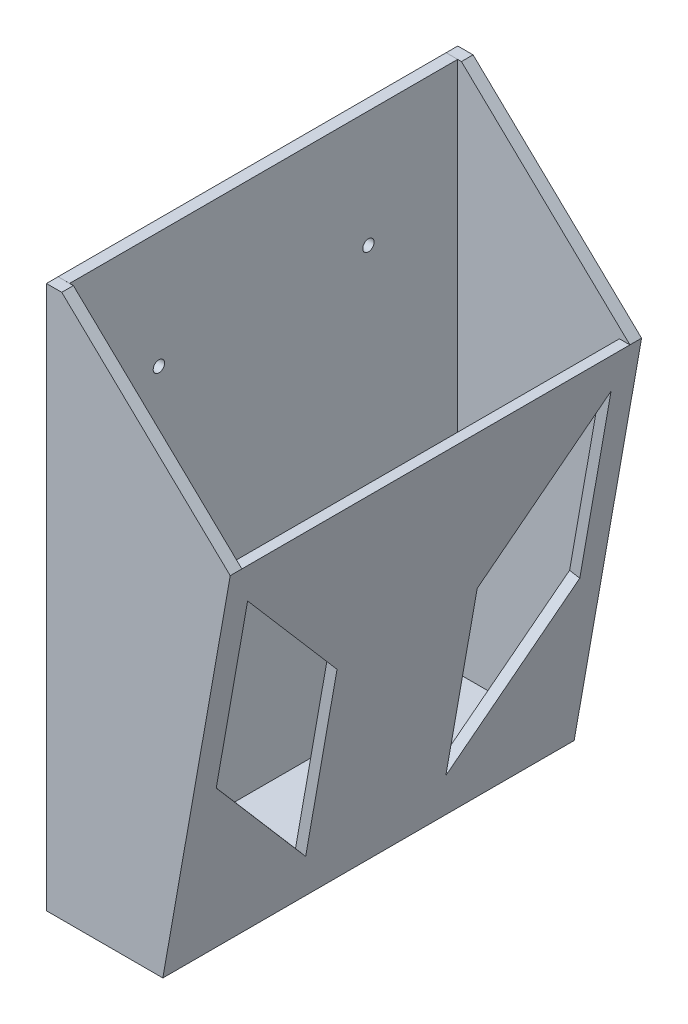
ISO-10303-21;
HEADER;
FILE_DESCRIPTION(('STEP AP214'),'2;1');
FILE_NAME('part.step','',(''),(''),'','','');
FILE_SCHEMA(('AUTOMOTIVE_DESIGN { 1 0 10303 214 1 1 1 1 }'));
ENDSEC;
DATA;
#1=APPLICATION_CONTEXT('core data for automotive mechanical design processes');
#2=APPLICATION_PROTOCOL_DEFINITION('international standard','automotive_design',2000,#1);
#3=PRODUCT_CONTEXT('',#1,'mechanical');
#4=PRODUCT('Part','Part','',(#3));
#5=PRODUCT_RELATED_PRODUCT_CATEGORY('part','',(#4));
#6=PRODUCT_DEFINITION_FORMATION('','',#4);
#7=PRODUCT_DEFINITION_CONTEXT('part definition',#1,'design');
#8=PRODUCT_DEFINITION('design','',#6,#7);
#9=PRODUCT_DEFINITION_SHAPE('','',#8);
#10=(LENGTH_UNIT() NAMED_UNIT(*) SI_UNIT(.MILLI.,.METRE.));
#11=(NAMED_UNIT(*) PLANE_ANGLE_UNIT() SI_UNIT($,.RADIAN.));
#12=(NAMED_UNIT(*) SI_UNIT($,.STERADIAN.) SOLID_ANGLE_UNIT());
#13=UNCERTAINTY_MEASURE_WITH_UNIT(LENGTH_MEASURE(1.E-05),#10,'distance_accuracy_value','');
#14=(GEOMETRIC_REPRESENTATION_CONTEXT(3) GLOBAL_UNCERTAINTY_ASSIGNED_CONTEXT((#13)) GLOBAL_UNIT_ASSIGNED_CONTEXT((#10,
#11,#12)) REPRESENTATION_CONTEXT('',''));
#15=CARTESIAN_POINT('',(0.,0.,0.));
#16=DIRECTION('',(0.,0.,1.));
#17=DIRECTION('',(1.,0.,0.));
#18=AXIS2_PLACEMENT_3D('',#15,#16,#17);
#19=CARTESIAN_POINT('',(47.3648177666926,98.4807753012209,3.));
#20=DIRECTION('',(-0.984807753012209,0.173648177666926,0.));
#21=DIRECTION('',(-0.173648177666926,-0.984807753012209,0.));
#22=AXIS2_PLACEMENT_3D('',#19,#20,#21);
#23=PLANE('',#22);
#24=DIRECTION('',(0.,0.,-1.));
#25=VECTOR('',#24,1.);
#26=CARTESIAN_POINT('',(47.3648177666926,98.4807753012209,3.));
#27=LINE('',#26,#25);
#28=CARTESIAN_POINT('',(47.3648177666926,98.4807753012209,103.));
#29=VERTEX_POINT('',#28);
#30=CARTESIAN_POINT('',(47.3648177666926,98.4807753012208,3.));
#31=VERTEX_POINT('',#30);
#32=EDGE_CURVE('E254',#29,#31,#27,.T.);
#33=ORIENTED_EDGE('',*,*,#32,.F.);
#34=DIRECTION('',(0.,0.,-1.));
#35=VECTOR('',#34,1.);
#36=CARTESIAN_POINT('',(47.3648177666926,98.4807753012209,106.));
#37=LINE('',#36,#35);
#38=CARTESIAN_POINT('',(47.3648177666926,98.4807753012209,106.));
#39=VERTEX_POINT('',#38);
#40=EDGE_CURVE('E309',#39,#29,#37,.T.);
#41=ORIENTED_EDGE('',*,*,#40,.F.);
#42=DIRECTION('',(0.173648177666926,0.984807753012209,0.));
#43=VECTOR('',#42,1.);
#44=CARTESIAN_POINT('',(47.3648177666926,98.4807753012209,106.));
#45=LINE('',#44,#43);
#46=CARTESIAN_POINT('',(30.,0.,106.));
#47=VERTEX_POINT('',#46);
#48=EDGE_CURVE('E289',#47,#39,#45,.T.);
#49=ORIENTED_EDGE('',*,*,#48,.F.);
#50=DIRECTION('',(0.,0.,-1.));
#51=VECTOR('',#50,1.);
#52=CARTESIAN_POINT('',(30.,0.,3.));
#53=LINE('',#52,#51);
#54=CARTESIAN_POINT('',(30.,0.,0.));
#55=VERTEX_POINT('',#54);
#56=EDGE_CURVE('E343',#47,#55,#53,.T.);
#57=ORIENTED_EDGE('',*,*,#56,.T.);
#58=DIRECTION('',(0.173648177666926,0.984807753012209,0.));
#59=VECTOR('',#58,1.);
#60=CARTESIAN_POINT('',(47.3648177666926,98.4807753012209,0.));
#61=LINE('',#60,#59);
#62=CARTESIAN_POINT('',(47.3648177666926,98.4807753012209,0.));
#63=VERTEX_POINT('',#62);
#64=EDGE_CURVE('E325',#55,#63,#61,.T.);
#65=ORIENTED_EDGE('',*,*,#64,.T.);
#66=DIRECTION('',(0.,0.,-1.));
#67=VECTOR('',#66,1.);
#68=CARTESIAN_POINT('',(47.3648177666926,98.4807753012209,3.));
#69=LINE('',#68,#67);
#70=EDGE_CURVE('E340',#31,#63,#69,.T.);
#71=ORIENTED_EDGE('',*,*,#70,.F.);
#72=EDGE_LOOP('',(#33,#41,#49,#57,#65,#71));
#73=FACE_BOUND('',#72,.T.);
#74=DIRECTION('',(0.173648177666926,0.984807753012209,0.));
#75=VECTOR('',#74,1.);
#76=CARTESIAN_POINT('',(37.5986469474715,43.09406828689,6.16043080319173));
#77=LINE('',#76,#75);
#78=CARTESIAN_POINT('',(37.5986469474715,43.09406828689,6.16043080319173));
#79=VERTEX_POINT('',#78);
#80=CARTESIAN_POINT('',(45.6769891712432,88.9086236732175,6.16043080319173));
#81=VERTEX_POINT('',#80);
#82=EDGE_CURVE('E210',#79,#81,#77,.T.);
#83=ORIENTED_EDGE('',*,*,#82,.F.);
#84=DIRECTION('',(0.130891365191688,0.742321819756579,-0.657134511672867));
#85=VECTOR('',#84,1.);
#86=CARTESIAN_POINT('',(37.5986469474715,43.09406828689,6.16043080319173));
#87=LINE('',#86,#85);
#88=CARTESIAN_POINT('',(31.8662908204586,10.5842612001863,34.9394800456153));
#89=VERTEX_POINT('',#88);
#90=EDGE_CURVE('E206',#89,#79,#87,.T.);
#91=ORIENTED_EDGE('',*,*,#90,.F.);
#92=DIRECTION('',(-0.173648177666926,-0.984807753012209,0.));
#93=VECTOR('',#92,1.);
#94=CARTESIAN_POINT('',(31.8662908204586,10.5842612001863,34.9394800456153));
#95=LINE('',#94,#93);
#96=CARTESIAN_POINT('',(39.9446330442303,56.3988165865138,34.9394800456153));
#97=VERTEX_POINT('',#96);
#98=EDGE_CURVE('E216',#97,#89,#95,.T.);
#99=ORIENTED_EDGE('',*,*,#98,.F.);
#100=DIRECTION('',(-0.130891365191688,-0.74232181975658,0.657134511672866));
#101=VECTOR('',#100,1.);
#102=CARTESIAN_POINT('',(45.6769891712432,88.9086236732175,6.16043080319173));
#103=LINE('',#102,#101);
#104=EDGE_CURVE('E213',#81,#97,#103,.T.);
#105=ORIENTED_EDGE('',*,*,#104,.F.);
#106=EDGE_LOOP('',(#83,#91,#99,#105));
#107=FACE_BOUND('',#106,.T.);
#108=DIRECTION('',(0.130891365191688,0.742321819756579,0.657134511672867));
#109=VECTOR('',#108,1.);
#110=CARTESIAN_POINT('',(37.5986469474715,43.0940682868899,99.8395691968083));
#111=LINE('',#110,#109);
#112=CARTESIAN_POINT('',(31.8662908204586,10.5842612001863,71.0605199543847));
#113=VERTEX_POINT('',#112);
#114=CARTESIAN_POINT('',(37.5986469474715,43.0940682868899,99.8395691968083));
#115=VERTEX_POINT('',#114);
#116=EDGE_CURVE('E48',#113,#115,#111,.T.);
#117=ORIENTED_EDGE('',*,*,#116,.T.);
#118=DIRECTION('',(0.173648177666926,0.984807753012209,0.));
#119=VECTOR('',#118,1.);
#120=CARTESIAN_POINT('',(37.5986469474715,43.0940682868899,99.8395691968083));
#121=LINE('',#120,#119);
#122=CARTESIAN_POINT('',(45.6769891712432,88.9086236732175,99.8395691968083));
#123=VERTEX_POINT('',#122);
#124=EDGE_CURVE('E199',#115,#123,#121,.T.);
#125=ORIENTED_EDGE('',*,*,#124,.T.);
#126=DIRECTION('',(-0.130891365191688,-0.742321819756579,-0.657134511672867));
#127=VECTOR('',#126,1.);
#128=CARTESIAN_POINT('',(45.6769891712432,88.9086236732175,99.8395691968083));
#129=LINE('',#128,#127);
#130=CARTESIAN_POINT('',(39.9446330442303,56.3988165865138,71.0605199543847));
#131=VERTEX_POINT('',#130);
#132=EDGE_CURVE('E185',#123,#131,#129,.T.);
#133=ORIENTED_EDGE('',*,*,#132,.T.);
#134=DIRECTION('',(-0.173648177666926,-0.984807753012209,0.));
#135=VECTOR('',#134,1.);
#136=CARTESIAN_POINT('',(31.8662908204586,10.5842612001863,71.0605199543847));
#137=LINE('',#136,#135);
#138=EDGE_CURVE('E194',#131,#113,#137,.T.);
#139=ORIENTED_EDGE('',*,*,#138,.T.);
#140=EDGE_LOOP('',(#117,#125,#133,#139));
#141=FACE_BOUND('',#140,.T.);
#142=ADVANCED_FACE('F33',(#73,#107,#141),#23,.F.);
#143=CARTESIAN_POINT('',(27.8242856541056,3.0061175714593,3.));
#144=DIRECTION('',(-0.984807753012209,0.173648177666926,0.));
#145=DIRECTION('',(-0.173648177666926,-0.984807753012209,0.));
#146=AXIS2_PLACEMENT_3D('',#143,#144,#145);
#147=PLANE('',#146);
#148=DIRECTION('',(-0.130891365191688,-0.742321819756579,0.657134511672867));
#149=VECTOR('',#148,1.);
#150=CARTESIAN_POINT('',(31.1837549221952,22.0586145551409,25.1915140532333));
#151=LINE('',#150,#149);
#152=CARTESIAN_POINT('',(34.9744620353146,43.5567828892713,6.16043080319173));
#153=VERTEX_POINT('',#152);
#154=CARTESIAN_POINT('',(29.2421059083017,11.0469758025677,34.9394800456153));
#155=VERTEX_POINT('',#154);
#156=EDGE_CURVE('E356',#153,#155,#151,.T.);
#157=ORIENTED_EDGE('',*,*,#156,.F.);
#158=DIRECTION('',(-0.173648177666926,-0.984807753012209,0.));
#159=VECTOR('',#158,1.);
#160=CARTESIAN_POINT('',(27.8242856541056,3.0061175714593,6.16043080319173));
#161=LINE('',#160,#159);
#162=CARTESIAN_POINT('',(43.0528042590863,89.3713382755988,6.16043080319173));
#163=VERTEX_POINT('',#162);
#164=EDGE_CURVE('E349',#163,#153,#161,.T.);
#165=ORIENTED_EDGE('',*,*,#164,.F.);
#166=DIRECTION('',(0.130891365191688,0.74232181975658,-0.657134511672866));
#167=VECTOR('',#166,1.);
#168=CARTESIAN_POINT('',(34.6721912444716,41.8425200485619,48.2349407054524));
#169=LINE('',#168,#167);
#170=CARTESIAN_POINT('',(37.3204481320733,56.8615311888952,34.9394800456153));
#171=VERTEX_POINT('',#170);
#172=EDGE_CURVE('E351',#171,#163,#169,.T.);
#173=ORIENTED_EDGE('',*,*,#172,.F.);
#174=DIRECTION('',(0.173648177666926,0.984807753012209,0.));
#175=VECTOR('',#174,1.);
#176=CARTESIAN_POINT('',(27.8242856541056,3.0061175714593,34.9394800456153));
#177=LINE('',#176,#175);
#178=EDGE_CURVE('E354',#155,#171,#177,.T.);
#179=ORIENTED_EDGE('',*,*,#178,.F.);
#180=EDGE_LOOP('',(#157,#165,#173,#179));
#181=FACE_BOUND('',#180,.T.);
#182=DIRECTION('',(0.173648177666926,0.984807753012209,0.));
#183=VECTOR('',#182,1.);
#184=CARTESIAN_POINT('',(27.8242856541056,3.0061175714593,103.));
#185=LINE('',#184,#183);
#186=CARTESIAN_POINT('',(27.8242856541056,3.0061175714593,103.));
#187=VERTEX_POINT('',#186);
#188=CARTESIAN_POINT('',(44.6590437857681,98.4807753012208,103.));
#189=VERTEX_POINT('',#188);
#190=EDGE_CURVE('E247',#187,#189,#185,.T.);
#191=ORIENTED_EDGE('',*,*,#190,.T.);
#192=DIRECTION('',(0.,0.,1.));
#193=VECTOR('',#192,1.);
#194=CARTESIAN_POINT('',(44.6590437857681,98.4807753012209,3.));
#195=LINE('',#194,#193);
#196=CARTESIAN_POINT('',(44.6590437857681,98.4807753012208,3.));
#197=VERTEX_POINT('',#196);
#198=EDGE_CURVE('E244',#197,#189,#195,.T.);
#199=ORIENTED_EDGE('',*,*,#198,.F.);
#200=DIRECTION('',(0.173648177666926,0.984807753012209,0.));
#201=VECTOR('',#200,1.);
#202=CARTESIAN_POINT('',(27.8242856541056,3.0061175714593,3.));
#203=LINE('',#202,#201);
#204=CARTESIAN_POINT('',(27.8242856541055,3.0061175714593,3.));
#205=VERTEX_POINT('',#204);
#206=EDGE_CURVE('E243',#205,#197,#203,.T.);
#207=ORIENTED_EDGE('',*,*,#206,.F.);
#208=DIRECTION('',(0.,0.,1.));
#209=VECTOR('',#208,1.);
#210=CARTESIAN_POINT('',(27.8242856541056,3.0061175714593,3.));
#211=LINE('',#210,#209);
#212=EDGE_CURVE('E240',#205,#187,#211,.T.);
#213=ORIENTED_EDGE('',*,*,#212,.T.);
#214=EDGE_LOOP('',(#191,#199,#207,#213));
#215=FACE_BOUND('',#214,.T.);
#216=DIRECTION('',(-0.173648177666926,-0.984807753012209,0.));
#217=VECTOR('',#216,1.);
#218=CARTESIAN_POINT('',(27.8242856541055,3.00611757145927,99.8395691968083));
#219=LINE('',#218,#217);
#220=CARTESIAN_POINT('',(43.0528042590863,89.3713382755988,99.8395691968083));
#221=VERTEX_POINT('',#220);
#222=CARTESIAN_POINT('',(34.9744620353146,43.5567828892713,99.8395691968083));
#223=VERTEX_POINT('',#222);
#224=EDGE_CURVE('E41',#221,#223,#219,.T.);
#225=ORIENTED_EDGE('',*,*,#224,.T.);
#226=DIRECTION('',(-0.130891365191688,-0.742321819756579,-0.657134511672867));
#227=VECTOR('',#226,1.);
#228=CARTESIAN_POINT('',(22.5824315874517,-26.7219140978444,37.625909303613));
#229=LINE('',#228,#227);
#230=CARTESIAN_POINT('',(29.2421059083017,11.0469758025677,71.0605199543847));
#231=VERTEX_POINT('',#230);
#232=EDGE_CURVE('E11',#223,#231,#229,.T.);
#233=ORIENTED_EDGE('',*,*,#232,.T.);
#234=DIRECTION('',(0.173648177666926,0.984807753012209,0.));
#235=VECTOR('',#234,1.);
#236=CARTESIAN_POINT('',(27.8242856541055,3.00611757145927,71.0605199543847));
#237=LINE('',#236,#235);
#238=CARTESIAN_POINT('',(37.3204481320733,56.8615311888952,71.0605199543847));
#239=VERTEX_POINT('',#238);
#240=EDGE_CURVE('E358',#231,#239,#237,.T.);
#241=ORIENTED_EDGE('',*,*,#240,.T.);
#242=DIRECTION('',(0.130891365191688,0.742321819756579,0.657134511672867));
#243=VECTOR('',#242,1.);
#244=CARTESIAN_POINT('',(26.0708679097282,-6.93800860442348,14.582482651394));
#245=LINE('',#244,#243);
#246=EDGE_CURVE('E188',#239,#221,#245,.T.);
#247=ORIENTED_EDGE('',*,*,#246,.T.);
#248=EDGE_LOOP('',(#225,#233,#241,#247));
#249=FACE_BOUND('',#248,.T.);
#250=ADVANCED_FACE('F362',(#181,#215,#249),#147,.T.);
#251=CARTESIAN_POINT('',(0.,0.,3.));
#252=DIRECTION('',(0.,0.,-1.));
#253=DIRECTION('',(-1.,0.,0.));
#254=AXIS2_PLACEMENT_3D('',#251,#252,#253);
#255=PLANE('',#254);
#256=DIRECTION('',(-1.,0.,0.));
#257=VECTOR('',#256,1.);
#258=CARTESIAN_POINT('',(47.3648177666926,98.4807753012209,3.));
#259=LINE('',#258,#257);
#260=EDGE_CURVE('E257',#31,#197,#259,.T.);
#261=ORIENTED_EDGE('',*,*,#260,.F.);
#262=DIRECTION('',(-0.722765541886876,0.691093316029731,0.));
#263=VECTOR('',#262,1.);
#264=CARTESIAN_POINT('',(3.94280189402707,140.,3.));
#265=LINE('',#264,#263);
#266=CARTESIAN_POINT('',(3.94280189402707,140.,3.));
#267=VERTEX_POINT('',#266);
#268=EDGE_CURVE('E316',#31,#267,#265,.T.);
#269=ORIENTED_EDGE('',*,*,#268,.T.);
#270=DIRECTION('',(-1.,0.,0.));
#271=VECTOR('',#270,1.);
#272=CARTESIAN_POINT('',(0.,140.,3.));
#273=LINE('',#272,#271);
#274=CARTESIAN_POINT('',(2.97567344961181,140.,3.));
#275=VERTEX_POINT('',#274);
#276=EDGE_CURVE('E318',#267,#275,#273,.T.);
#277=ORIENTED_EDGE('',*,*,#276,.T.);
#278=DIRECTION('',(0.,-1.,0.));
#279=VECTOR('',#278,1.);
#280=CARTESIAN_POINT('',(2.97567344961181,140.006117571459,3.));
#281=LINE('',#280,#279);
#282=CARTESIAN_POINT('',(2.97567344961181,3.0061175714593,3.));
#283=VERTEX_POINT('',#282);
#284=EDGE_CURVE('E275',#275,#283,#281,.T.);
#285=ORIENTED_EDGE('',*,*,#284,.T.);
#286=DIRECTION('',(-1.,0.,0.));
#287=VECTOR('',#286,1.);
#288=CARTESIAN_POINT('',(0.,3.0061175714593,3.));
#289=LINE('',#288,#287);
#290=EDGE_CURVE('E311',#205,#283,#289,.T.);
#291=ORIENTED_EDGE('',*,*,#290,.F.);
#292=ORIENTED_EDGE('',*,*,#206,.T.);
#293=EDGE_LOOP('',(#261,#269,#277,#285,#291,#292));
#294=FACE_BOUND('',#293,.T.);
#295=ADVANCED_FACE('F385',(#294),#255,.F.);
#296=CARTESIAN_POINT('',(0.,3.0061175714593,103.));
#297=DIRECTION('',(0.,-1.,0.));
#298=DIRECTION('',(0.,0.,-1.));
#299=AXIS2_PLACEMENT_3D('',#296,#297,#298);
#300=PLANE('',#299);
#301=ORIENTED_EDGE('',*,*,#212,.F.);
#302=ORIENTED_EDGE('',*,*,#290,.T.);
#303=DIRECTION('',(0.,0.,-1.));
#304=VECTOR('',#303,1.);
#305=CARTESIAN_POINT('',(2.97567344961181,3.0061175714593,3.));
#306=LINE('',#305,#304);
#307=CARTESIAN_POINT('',(2.97567344961181,3.0061175714593,103.));
#308=VERTEX_POINT('',#307);
#309=EDGE_CURVE('E260',#308,#283,#306,.T.);
#310=ORIENTED_EDGE('',*,*,#309,.F.);
#311=DIRECTION('',(-1.,0.,0.));
#312=VECTOR('',#311,1.);
#313=CARTESIAN_POINT('',(0.,3.0061175714593,103.));
#314=LINE('',#313,#312);
#315=EDGE_CURVE('E312',#187,#308,#314,.T.);
#316=ORIENTED_EDGE('',*,*,#315,.F.);
#317=EDGE_LOOP('',(#301,#302,#310,#316));
#318=FACE_BOUND('',#317,.T.);
#319=ADVANCED_FACE('F410',(#318),#300,.F.);
#320=CARTESIAN_POINT('',(0.,0.,103.));
#321=DIRECTION('',(0.,0.,-1.));
#322=DIRECTION('',(-1.,0.,0.));
#323=AXIS2_PLACEMENT_3D('',#320,#321,#322);
#324=PLANE('',#323);
#325=DIRECTION('',(1.,0.,0.));
#326=VECTOR('',#325,1.);
#327=CARTESIAN_POINT('',(47.3648177666926,98.4807753012209,103.));
#328=LINE('',#327,#326);
#329=EDGE_CURVE('E250',#189,#29,#328,.T.);
#330=ORIENTED_EDGE('',*,*,#329,.F.);
#331=ORIENTED_EDGE('',*,*,#190,.F.);
#332=ORIENTED_EDGE('',*,*,#315,.T.);
#333=DIRECTION('',(0.,1.,0.));
#334=VECTOR('',#333,1.);
#335=CARTESIAN_POINT('',(2.97567344961181,0.,103.));
#336=LINE('',#335,#334);
#337=CARTESIAN_POINT('',(2.97567344961181,140.,103.));
#338=VERTEX_POINT('',#337);
#339=EDGE_CURVE('E346',#308,#338,#336,.T.);
#340=ORIENTED_EDGE('',*,*,#339,.T.);
#341=DIRECTION('',(-1.,0.,0.));
#342=VECTOR('',#341,1.);
#343=CARTESIAN_POINT('',(0.,140.,103.));
#344=LINE('',#343,#342);
#345=CARTESIAN_POINT('',(3.94280189402707,140.,103.));
#346=VERTEX_POINT('',#345);
#347=EDGE_CURVE('E290',#346,#338,#344,.T.);
#348=ORIENTED_EDGE('',*,*,#347,.F.);
#349=DIRECTION('',(-0.722765541886876,0.691093316029731,0.));
#350=VECTOR('',#349,1.);
#351=CARTESIAN_POINT('',(3.94280189402707,140.,103.));
#352=LINE('',#351,#350);
#353=EDGE_CURVE('E285',#29,#346,#352,.T.);
#354=ORIENTED_EDGE('',*,*,#353,.F.);
#355=EDGE_LOOP('',(#330,#331,#332,#340,#348,#354));
#356=FACE_BOUND('',#355,.T.);
#357=ADVANCED_FACE('F414',(#356),#324,.T.);
#358=CARTESIAN_POINT('',(30.,0.,3.));
#359=DIRECTION('',(0.,1.,0.));
#360=DIRECTION('',(-1.,0.,0.));
#361=AXIS2_PLACEMENT_3D('',#358,#359,#360);
#362=PLANE('',#361);
#363=DIRECTION('',(1.,0.,0.));
#364=VECTOR('',#363,1.);
#365=CARTESIAN_POINT('',(30.,0.,0.));
#366=LINE('',#365,#364);
#367=CARTESIAN_POINT('',(0.,0.,0.));
#368=VERTEX_POINT('',#367);
#369=EDGE_CURVE('E314',#368,#55,#366,.T.);
#370=ORIENTED_EDGE('',*,*,#369,.T.);
#371=ORIENTED_EDGE('',*,*,#56,.F.);
#372=DIRECTION('',(1.,0.,0.));
#373=VECTOR('',#372,1.);
#374=CARTESIAN_POINT('',(30.,0.,106.));
#375=LINE('',#374,#373);
#376=CARTESIAN_POINT('',(0.,0.,106.));
#377=VERTEX_POINT('',#376);
#378=EDGE_CURVE('E286',#377,#47,#375,.T.);
#379=ORIENTED_EDGE('',*,*,#378,.F.);
#380=DIRECTION('',(0.,0.,-1.));
#381=VECTOR('',#380,1.);
#382=CARTESIAN_POINT('',(0.,0.,3.));
#383=LINE('',#382,#381);
#384=EDGE_CURVE('E322',#377,#368,#383,.T.);
#385=ORIENTED_EDGE('',*,*,#384,.T.);
#386=EDGE_LOOP('',(#370,#371,#379,#385));
#387=FACE_BOUND('',#386,.T.);
#388=ADVANCED_FACE('F35',(#387),#362,.F.);
#389=CARTESIAN_POINT('',(3.94280189402707,140.,3.));
#390=DIRECTION('',(-0.691093316029731,-0.722765541886876,0.));
#391=DIRECTION('',(0.722765541886876,-0.691093316029731,0.));
#392=AXIS2_PLACEMENT_3D('',#389,#390,#391);
#393=PLANE('',#392);
#394=DIRECTION('',(-0.722765541886876,0.691093316029731,0.));
#395=VECTOR('',#394,1.);
#396=CARTESIAN_POINT('',(3.94280189402707,140.,0.));
#397=LINE('',#396,#395);
#398=CARTESIAN_POINT('',(3.94280189402707,140.,0.));
#399=VERTEX_POINT('',#398);
#400=EDGE_CURVE('E327',#63,#399,#397,.T.);
#401=ORIENTED_EDGE('',*,*,#400,.T.);
#402=DIRECTION('',(0.,0.,-1.));
#403=VECTOR('',#402,1.);
#404=CARTESIAN_POINT('',(3.94280189402707,140.,3.));
#405=LINE('',#404,#403);
#406=EDGE_CURVE('E337',#267,#399,#405,.T.);
#407=ORIENTED_EDGE('',*,*,#406,.F.);
#408=ORIENTED_EDGE('',*,*,#268,.F.);
#409=ORIENTED_EDGE('',*,*,#70,.T.);
#410=EDGE_LOOP('',(#401,#407,#408,#409));
#411=FACE_BOUND('',#410,.T.);
#412=ADVANCED_FACE('F391',(#411),#393,.F.);
#413=CARTESIAN_POINT('',(0.,140.,3.));
#414=DIRECTION('',(0.,-1.,0.));
#415=DIRECTION('',(0.,0.,-1.));
#416=AXIS2_PLACEMENT_3D('',#413,#414,#415);
#417=PLANE('',#416);
#418=DIRECTION('',(-1.,0.,0.));
#419=VECTOR('',#418,1.);
#420=CARTESIAN_POINT('',(0.,140.,0.));
#421=LINE('',#420,#419);
#422=CARTESIAN_POINT('',(0.,140.,0.));
#423=VERTEX_POINT('',#422);
#424=EDGE_CURVE('E329',#399,#423,#421,.T.);
#425=ORIENTED_EDGE('',*,*,#424,.T.);
#426=DIRECTION('',(0.,0.,-1.));
#427=VECTOR('',#426,1.);
#428=CARTESIAN_POINT('',(0.,140.,3.));
#429=LINE('',#428,#427);
#430=CARTESIAN_POINT('',(0.,140.,3.));
#431=VERTEX_POINT('',#430);
#432=EDGE_CURVE('E334',#431,#423,#429,.T.);
#433=ORIENTED_EDGE('',*,*,#432,.F.);
#434=DIRECTION('',(-1.,0.,0.));
#435=VECTOR('',#434,1.);
#436=CARTESIAN_POINT('',(0.,140.,3.));
#437=LINE('',#436,#435);
#438=EDGE_CURVE('E283',#275,#431,#437,.T.);
#439=ORIENTED_EDGE('',*,*,#438,.F.);
#440=ORIENTED_EDGE('',*,*,#276,.F.);
#441=ORIENTED_EDGE('',*,*,#406,.T.);
#442=EDGE_LOOP('',(#425,#433,#439,#440,#441));
#443=FACE_BOUND('',#442,.T.);
#444=ADVANCED_FACE('F394',(#443),#417,.F.);
#445=CARTESIAN_POINT('',(0.,0.,3.));
#446=DIRECTION('',(1.,0.,0.));
#447=DIRECTION('',(0.,0.,-1.));
#448=AXIS2_PLACEMENT_3D('',#445,#446,#447);
#449=PLANE('',#448);
#450=CARTESIAN_POINT('',(0.,110.,26.));
#451=DIRECTION('',(1.,0.,0.));
#452=DIRECTION('',(0.,0.,-1.));
#453=AXIS2_PLACEMENT_3D('',#450,#451,#452);
#454=CIRCLE('',#453,1.46214160124625);
#455=CARTESIAN_POINT('',(0.,110.,24.5378583987538));
#456=VERTEX_POINT('',#455);
#457=EDGE_CURVE('E231',#456,#456,#454,.F.);
#458=ORIENTED_EDGE('',*,*,#457,.F.);
#459=EDGE_LOOP('',(#458));
#460=FACE_BOUND('',#459,.T.);
#461=CARTESIAN_POINT('',(0.,110.,80.));
#462=DIRECTION('',(1.,0.,0.));
#463=DIRECTION('',(0.,0.,-1.));
#464=AXIS2_PLACEMENT_3D('',#461,#462,#463);
#465=CIRCLE('',#464,1.46214160124625);
#466=CARTESIAN_POINT('',(0.,110.,78.5378583987538));
#467=VERTEX_POINT('',#466);
#468=EDGE_CURVE('E237',#467,#467,#465,.T.);
#469=ORIENTED_EDGE('',*,*,#468,.T.);
#470=EDGE_LOOP('',(#469));
#471=FACE_BOUND('',#470,.T.);
#472=DIRECTION('',(0.,-1.,0.));
#473=VECTOR('',#472,1.);
#474=CARTESIAN_POINT('',(0.,140.006117571459,3.));
#475=LINE('',#474,#473);
#476=CARTESIAN_POINT('',(0.,140.006117571459,3.));
#477=VERTEX_POINT('',#476);
#478=EDGE_CURVE('E270',#477,#431,#475,.T.);
#479=ORIENTED_EDGE('',*,*,#478,.T.);
#480=ORIENTED_EDGE('',*,*,#432,.T.);
#481=DIRECTION('',(0.,-1.,0.));
#482=VECTOR('',#481,1.);
#483=CARTESIAN_POINT('',(0.,0.,0.));
#484=LINE('',#483,#482);
#485=EDGE_CURVE('E319',#423,#368,#484,.T.);
#486=ORIENTED_EDGE('',*,*,#485,.T.);
#487=ORIENTED_EDGE('',*,*,#384,.F.);
#488=DIRECTION('',(0.,-1.,0.));
#489=VECTOR('',#488,1.);
#490=CARTESIAN_POINT('',(0.,0.,106.));
#491=LINE('',#490,#489);
#492=CARTESIAN_POINT('',(0.,140.,106.));
#493=VERTEX_POINT('',#492);
#494=EDGE_CURVE('E296',#493,#377,#491,.T.);
#495=ORIENTED_EDGE('',*,*,#494,.F.);
#496=DIRECTION('',(0.,0.,-1.));
#497=VECTOR('',#496,1.);
#498=CARTESIAN_POINT('',(0.,140.,106.));
#499=LINE('',#498,#497);
#500=CARTESIAN_POINT('',(0.,140.,103.));
#501=VERTEX_POINT('',#500);
#502=EDGE_CURVE('E299',#493,#501,#499,.T.);
#503=ORIENTED_EDGE('',*,*,#502,.T.);
#504=DIRECTION('',(0.,-1.,0.));
#505=VECTOR('',#504,1.);
#506=CARTESIAN_POINT('',(0.,140.006117571459,103.));
#507=LINE('',#506,#505);
#508=CARTESIAN_POINT('',(0.,140.006117571459,103.));
#509=VERTEX_POINT('',#508);
#510=EDGE_CURVE('E281',#509,#501,#507,.T.);
#511=ORIENTED_EDGE('',*,*,#510,.F.);
#512=DIRECTION('',(0.,0.,1.));
#513=VECTOR('',#512,1.);
#514=CARTESIAN_POINT('',(0.,140.006117571459,3.));
#515=LINE('',#514,#513);
#516=EDGE_CURVE('E261',#477,#509,#515,.T.);
#517=ORIENTED_EDGE('',*,*,#516,.F.);
#518=EDGE_LOOP('',(#479,#480,#486,#487,#495,#503,#511,#517));
#519=FACE_BOUND('',#518,.T.);
#520=ADVANCED_FACE('F398',(#460,#471,#519),#449,.F.);
#521=CARTESIAN_POINT('',(0.,0.,0.));
#522=DIRECTION('',(0.,0.,-1.));
#523=DIRECTION('',(-1.,0.,0.));
#524=AXIS2_PLACEMENT_3D('',#521,#522,#523);
#525=PLANE('',#524);
#526=ORIENTED_EDGE('',*,*,#369,.F.);
#527=ORIENTED_EDGE('',*,*,#485,.F.);
#528=ORIENTED_EDGE('',*,*,#424,.F.);
#529=ORIENTED_EDGE('',*,*,#400,.F.);
#530=ORIENTED_EDGE('',*,*,#64,.F.);
#531=EDGE_LOOP('',(#526,#527,#528,#529,#530));
#532=FACE_BOUND('',#531,.T.);
#533=ADVANCED_FACE('F402',(#532),#525,.T.);
#534=CARTESIAN_POINT('',(3.94280189402707,140.,106.));
#535=DIRECTION('',(-0.691093316029731,-0.722765541886876,0.));
#536=DIRECTION('',(0.722765541886876,-0.691093316029731,0.));
#537=AXIS2_PLACEMENT_3D('',#534,#535,#536);
#538=PLANE('',#537);
#539=ORIENTED_EDGE('',*,*,#353,.T.);
#540=DIRECTION('',(0.,0.,-1.));
#541=VECTOR('',#540,1.);
#542=CARTESIAN_POINT('',(3.94280189402707,140.,106.));
#543=LINE('',#542,#541);
#544=CARTESIAN_POINT('',(3.94280189402707,140.,106.));
#545=VERTEX_POINT('',#544);
#546=EDGE_CURVE('E306',#545,#346,#543,.T.);
#547=ORIENTED_EDGE('',*,*,#546,.F.);
#548=DIRECTION('',(-0.722765541886876,0.691093316029731,0.));
#549=VECTOR('',#548,1.);
#550=CARTESIAN_POINT('',(3.94280189402707,140.,106.));
#551=LINE('',#550,#549);
#552=EDGE_CURVE('E292',#39,#545,#551,.T.);
#553=ORIENTED_EDGE('',*,*,#552,.F.);
#554=ORIENTED_EDGE('',*,*,#40,.T.);
#555=EDGE_LOOP('',(#539,#547,#553,#554));
#556=FACE_BOUND('',#555,.T.);
#557=ADVANCED_FACE('F406',(#556),#538,.F.);
#558=CARTESIAN_POINT('',(0.,140.,106.));
#559=DIRECTION('',(0.,-1.,0.));
#560=DIRECTION('',(0.,0.,-1.));
#561=AXIS2_PLACEMENT_3D('',#558,#559,#560);
#562=PLANE('',#561);
#563=ORIENTED_EDGE('',*,*,#347,.T.);
#564=EDGE_CURVE('E301',#338,#501,#344,.T.);
#565=ORIENTED_EDGE('',*,*,#564,.T.);
#566=ORIENTED_EDGE('',*,*,#502,.F.);
#567=DIRECTION('',(-1.,0.,0.));
#568=VECTOR('',#567,1.);
#569=CARTESIAN_POINT('',(0.,140.,106.));
#570=LINE('',#569,#568);
#571=EDGE_CURVE('E294',#545,#493,#570,.T.);
#572=ORIENTED_EDGE('',*,*,#571,.F.);
#573=ORIENTED_EDGE('',*,*,#546,.T.);
#574=EDGE_LOOP('',(#563,#565,#566,#572,#573));
#575=FACE_BOUND('',#574,.T.);
#576=ADVANCED_FACE('F418',(#575),#562,.F.);
#577=CARTESIAN_POINT('',(0.,0.,106.));
#578=DIRECTION('',(0.,0.,-1.));
#579=DIRECTION('',(-1.,0.,0.));
#580=AXIS2_PLACEMENT_3D('',#577,#578,#579);
#581=PLANE('',#580);
#582=ORIENTED_EDGE('',*,*,#378,.T.);
#583=ORIENTED_EDGE('',*,*,#48,.T.);
#584=ORIENTED_EDGE('',*,*,#552,.T.);
#585=ORIENTED_EDGE('',*,*,#571,.T.);
#586=ORIENTED_EDGE('',*,*,#494,.T.);
#587=EDGE_LOOP('',(#582,#583,#584,#585,#586));
#588=FACE_BOUND('',#587,.T.);
#589=ADVANCED_FACE('F422',(#588),#581,.F.);
#590=CARTESIAN_POINT('',(0.,140.006117571459,3.));
#591=DIRECTION('',(0.,0.,1.));
#592=DIRECTION('',(1.,0.,0.));
#593=AXIS2_PLACEMENT_3D('',#590,#591,#592);
#594=PLANE('',#593);
#595=CARTESIAN_POINT('',(2.97567344961181,140.006117571459,3.));
#596=VERTEX_POINT('',#595);
#597=EDGE_CURVE('E276',#596,#275,#281,.T.);
#598=ORIENTED_EDGE('',*,*,#597,.T.);
#599=ORIENTED_EDGE('',*,*,#438,.T.);
#600=ORIENTED_EDGE('',*,*,#478,.F.);
#601=DIRECTION('',(-1.,0.,0.));
#602=VECTOR('',#601,1.);
#603=CARTESIAN_POINT('',(0.,140.006117571459,3.));
#604=LINE('',#603,#602);
#605=EDGE_CURVE('E268',#596,#477,#604,.T.);
#606=ORIENTED_EDGE('',*,*,#605,.F.);
#607=EDGE_LOOP('',(#598,#599,#600,#606));
#608=FACE_BOUND('',#607,.T.);
#609=ADVANCED_FACE('F429',(#608),#594,.F.);
#610=CARTESIAN_POINT('',(0.,140.006117571459,103.));
#611=DIRECTION('',(0.,0.,-1.));
#612=DIRECTION('',(-1.,0.,0.));
#613=AXIS2_PLACEMENT_3D('',#610,#611,#612);
#614=PLANE('',#613);
#615=ORIENTED_EDGE('',*,*,#510,.T.);
#616=ORIENTED_EDGE('',*,*,#564,.F.);
#617=DIRECTION('',(0.,-1.,0.));
#618=VECTOR('',#617,1.);
#619=CARTESIAN_POINT('',(2.97567344961181,140.006117571459,103.));
#620=LINE('',#619,#618);
#621=CARTESIAN_POINT('',(2.97567344961181,140.006117571459,103.));
#622=VERTEX_POINT('',#621);
#623=EDGE_CURVE('E279',#622,#338,#620,.T.);
#624=ORIENTED_EDGE('',*,*,#623,.F.);
#625=DIRECTION('',(1.,0.,0.));
#626=VECTOR('',#625,1.);
#627=CARTESIAN_POINT('',(0.,140.006117571459,103.));
#628=LINE('',#627,#626);
#629=EDGE_CURVE('E264',#509,#622,#628,.T.);
#630=ORIENTED_EDGE('',*,*,#629,.F.);
#631=EDGE_LOOP('',(#615,#616,#624,#630));
#632=FACE_BOUND('',#631,.T.);
#633=ADVANCED_FACE('F431',(#632),#614,.F.);
#634=CARTESIAN_POINT('',(2.97567344961181,140.006117571459,3.));
#635=DIRECTION('',(-1.,0.,0.));
#636=DIRECTION('',(0.,0.,1.));
#637=AXIS2_PLACEMENT_3D('',#634,#635,#636);
#638=PLANE('',#637);
#639=CARTESIAN_POINT('',(2.97567344961181,110.,26.));
#640=DIRECTION('',(-1.,0.,0.));
#641=DIRECTION('',(0.,0.,1.));
#642=AXIS2_PLACEMENT_3D('',#639,#640,#641);
#643=CIRCLE('',#642,1.46214160124625);
#644=CARTESIAN_POINT('',(2.97567344961181,110.,27.4621416012463));
#645=VERTEX_POINT('',#644);
#646=EDGE_CURVE('E222',#645,#645,#643,.T.);
#647=ORIENTED_EDGE('',*,*,#646,.T.);
#648=EDGE_LOOP('',(#647));
#649=FACE_BOUND('',#648,.T.);
#650=CARTESIAN_POINT('',(2.97567344961181,110.,80.));
#651=DIRECTION('',(1.,0.,0.));
#652=DIRECTION('',(0.,0.,-1.));
#653=AXIS2_PLACEMENT_3D('',#650,#651,#652);
#654=CIRCLE('',#653,1.46214160124625);
#655=CARTESIAN_POINT('',(2.97567344961181,110.,78.5378583987538));
#656=VERTEX_POINT('',#655);
#657=EDGE_CURVE('E234',#656,#656,#654,.T.);
#658=ORIENTED_EDGE('',*,*,#657,.F.);
#659=EDGE_LOOP('',(#658));
#660=FACE_BOUND('',#659,.T.);
#661=ORIENTED_EDGE('',*,*,#309,.T.);
#662=ORIENTED_EDGE('',*,*,#284,.F.);
#663=ORIENTED_EDGE('',*,*,#597,.F.);
#664=DIRECTION('',(0.,0.,-1.));
#665=VECTOR('',#664,1.);
#666=CARTESIAN_POINT('',(2.97567344961181,140.006117571459,3.));
#667=LINE('',#666,#665);
#668=EDGE_CURVE('E266',#622,#596,#667,.T.);
#669=ORIENTED_EDGE('',*,*,#668,.F.);
#670=ORIENTED_EDGE('',*,*,#623,.T.);
#671=ORIENTED_EDGE('',*,*,#339,.F.);
#672=EDGE_LOOP('',(#661,#662,#663,#669,#670,#671));
#673=FACE_BOUND('',#672,.T.);
#674=ADVANCED_FACE('F434',(#649,#660,#673),#638,.F.);
#675=CARTESIAN_POINT('',(0.,140.006117571459,0.));
#676=DIRECTION('',(0.,1.,0.));
#677=DIRECTION('',(0.,0.,1.));
#678=AXIS2_PLACEMENT_3D('',#675,#676,#677);
#679=PLANE('',#678);
#680=ORIENTED_EDGE('',*,*,#516,.T.);
#681=ORIENTED_EDGE('',*,*,#629,.T.);
#682=ORIENTED_EDGE('',*,*,#668,.T.);
#683=ORIENTED_EDGE('',*,*,#605,.T.);
#684=EDGE_LOOP('',(#680,#681,#682,#683));
#685=FACE_BOUND('',#684,.T.);
#686=ADVANCED_FACE('F438',(#685),#679,.T.);
#687=CARTESIAN_POINT('',(16.8347581316626,98.4807753012209,0.));
#688=DIRECTION('',(0.,-1.,0.));
#689=DIRECTION('',(0.,0.,-1.));
#690=AXIS2_PLACEMENT_3D('',#687,#688,#689);
#691=PLANE('',#690);
#692=ORIENTED_EDGE('',*,*,#32,.T.);
#693=ORIENTED_EDGE('',*,*,#260,.T.);
#694=ORIENTED_EDGE('',*,*,#198,.T.);
#695=ORIENTED_EDGE('',*,*,#329,.T.);
#696=EDGE_LOOP('',(#692,#693,#694,#695));
#697=FACE_BOUND('',#696,.T.);
#698=ADVANCED_FACE('F445',(#697),#691,.F.);
#699=CARTESIAN_POINT('',(-7.02432655038819,110.,80.));
#700=DIRECTION('',(1.,0.,0.));
#701=DIRECTION('',(0.,0.,-1.));
#702=AXIS2_PLACEMENT_3D('',#699,#700,#701);
#703=CYLINDRICAL_SURFACE('',#702,1.46214160124625);
#704=ORIENTED_EDGE('',*,*,#657,.T.);
#705=EDGE_LOOP('',(#704));
#706=FACE_BOUND('',#705,.T.);
#707=ORIENTED_EDGE('',*,*,#468,.F.);
#708=EDGE_LOOP('',(#707));
#709=FACE_BOUND('',#708,.T.);
#710=ADVANCED_FACE('F448',(#706,#709),#703,.F.);
#711=CARTESIAN_POINT('',(-7.02432655038819,110.,26.));
#712=DIRECTION('',(1.,0.,0.));
#713=DIRECTION('',(0.,0.,-1.));
#714=AXIS2_PLACEMENT_3D('',#711,#712,#713);
#715=CYLINDRICAL_SURFACE('',#714,1.46214160124625);
#716=ORIENTED_EDGE('',*,*,#646,.F.);
#717=EDGE_LOOP('',(#716));
#718=FACE_BOUND('',#717,.T.);
#719=ORIENTED_EDGE('',*,*,#457,.T.);
#720=EDGE_LOOP('',(#719));
#721=FACE_BOUND('',#720,.T.);
#722=ADVANCED_FACE('F453',(#718,#721),#715,.F.);
#723=CARTESIAN_POINT('',(27.7505694173495,44.8305500635592,6.16043080319173));
#724=DIRECTION('',(-0.114110210434039,-0.647151161867331,-0.753773330364284));
#725=DIRECTION('',(0.,0.758729276355679,-0.651406083177605));
#726=AXIS2_PLACEMENT_3D('',#723,#724,#725);
#727=PLANE('',#726);
#728=ORIENTED_EDGE('',*,*,#156,.T.);
#729=DIRECTION('',(0.984807753012209,-0.173648177666926,0.));
#730=VECTOR('',#729,1.);
#731=CARTESIAN_POINT('',(22.0182132903365,12.3207429768556,34.9394800456153));
#732=LINE('',#731,#730);
#733=EDGE_CURVE('E220',#155,#89,#732,.T.);
#734=ORIENTED_EDGE('',*,*,#733,.T.);
#735=ORIENTED_EDGE('',*,*,#90,.T.);
#736=DIRECTION('',(0.984807753012209,-0.173648177666926,0.));
#737=VECTOR('',#736,1.);
#738=CARTESIAN_POINT('',(27.7505694173495,44.8305500635592,6.16043080319173));
#739=LINE('',#738,#737);
#740=EDGE_CURVE('E219',#153,#79,#739,.T.);
#741=ORIENTED_EDGE('',*,*,#740,.F.);
#742=EDGE_LOOP('',(#728,#734,#735,#741));
#743=FACE_BOUND('',#742,.T.);
#744=ADVANCED_FACE('F457',(#743),#727,.F.);
#745=CARTESIAN_POINT('',(22.0182132903365,12.3207429768556,34.9394800456153));
#746=DIRECTION('',(0.,0.,1.));
#747=DIRECTION('',(0.,-1.,0.));
#748=AXIS2_PLACEMENT_3D('',#745,#746,#747);
#749=PLANE('',#748);
#750=ORIENTED_EDGE('',*,*,#178,.T.);
#751=DIRECTION('',(0.984807753012209,-0.173648177666926,0.));
#752=VECTOR('',#751,1.);
#753=CARTESIAN_POINT('',(30.0965555141082,58.1352983631831,34.9394800456153));
#754=LINE('',#753,#752);
#755=EDGE_CURVE('E223',#171,#97,#754,.T.);
#756=ORIENTED_EDGE('',*,*,#755,.T.);
#757=ORIENTED_EDGE('',*,*,#98,.T.);
#758=ORIENTED_EDGE('',*,*,#733,.F.);
#759=EDGE_LOOP('',(#750,#756,#757,#758));
#760=FACE_BOUND('',#759,.T.);
#761=ADVANCED_FACE('F460',(#760),#749,.F.);
#762=CARTESIAN_POINT('',(35.8289116411211,90.6451054498867,6.16043080319173));
#763=DIRECTION('',(0.114110210434039,0.647151161867331,0.753773330364284));
#764=DIRECTION('',(0.,-0.758729276355679,0.651406083177604));
#765=AXIS2_PLACEMENT_3D('',#762,#763,#764);
#766=PLANE('',#765);
#767=ORIENTED_EDGE('',*,*,#172,.T.);
#768=DIRECTION('',(0.984807753012209,-0.173648177666926,0.));
#769=VECTOR('',#768,1.);
#770=CARTESIAN_POINT('',(35.8289116411211,90.6451054498867,6.16043080319173));
#771=LINE('',#770,#769);
#772=EDGE_CURVE('E225',#163,#81,#771,.T.);
#773=ORIENTED_EDGE('',*,*,#772,.T.);
#774=ORIENTED_EDGE('',*,*,#104,.T.);
#775=ORIENTED_EDGE('',*,*,#755,.F.);
#776=EDGE_LOOP('',(#767,#773,#774,#775));
#777=FACE_BOUND('',#776,.T.);
#778=ADVANCED_FACE('F375',(#777),#766,.F.);
#779=CARTESIAN_POINT('',(27.7505694173495,44.8305500635592,6.16043080319173));
#780=DIRECTION('',(0.,0.,-1.));
#781=DIRECTION('',(-1.,0.,0.));
#782=AXIS2_PLACEMENT_3D('',#779,#780,#781);
#783=PLANE('',#782);
#784=ORIENTED_EDGE('',*,*,#164,.T.);
#785=ORIENTED_EDGE('',*,*,#740,.T.);
#786=ORIENTED_EDGE('',*,*,#82,.T.);
#787=ORIENTED_EDGE('',*,*,#772,.F.);
#788=EDGE_LOOP('',(#784,#785,#786,#787));
#789=FACE_BOUND('',#788,.T.);
#790=ADVANCED_FACE('F368',(#789),#783,.F.);
#791=CARTESIAN_POINT('',(27.7505694173495,44.8305500635592,99.8395691968083));
#792=DIRECTION('',(0.114110210434039,0.647151161867331,-0.753773330364283));
#793=DIRECTION('',(0.,0.758729276355678,0.651406083177605));
#794=AXIS2_PLACEMENT_3D('',#791,#792,#793);
#795=PLANE('',#794);
#796=DIRECTION('',(0.984807753012209,-0.173648177666926,0.));
#797=VECTOR('',#796,1.);
#798=CARTESIAN_POINT('',(27.7505694173495,44.8305500635592,99.8395691968083));
#799=LINE('',#798,#797);
#800=EDGE_CURVE('E204',#223,#115,#799,.T.);
#801=ORIENTED_EDGE('',*,*,#800,.T.);
#802=ORIENTED_EDGE('',*,*,#116,.F.);
#803=DIRECTION('',(0.984807753012209,-0.173648177666926,0.));
#804=VECTOR('',#803,1.);
#805=CARTESIAN_POINT('',(22.0182132903365,12.3207429768556,71.0605199543847));
#806=LINE('',#805,#804);
#807=EDGE_CURVE('E191',#231,#113,#806,.T.);
#808=ORIENTED_EDGE('',*,*,#807,.F.);
#809=ORIENTED_EDGE('',*,*,#232,.F.);
#810=EDGE_LOOP('',(#801,#802,#808,#809));
#811=FACE_BOUND('',#810,.T.);
#812=ADVANCED_FACE('F366',(#811),#795,.T.);
#813=CARTESIAN_POINT('',(27.7505694173495,44.8305500635592,99.8395691968083));
#814=DIRECTION('',(0.,0.,-1.));
#815=DIRECTION('',(0.,1.,0.));
#816=AXIS2_PLACEMENT_3D('',#813,#814,#815);
#817=PLANE('',#816);
#818=DIRECTION('',(0.984807753012209,-0.173648177666926,0.));
#819=VECTOR('',#818,1.);
#820=CARTESIAN_POINT('',(35.8289116411211,90.6451054498867,99.8395691968083));
#821=LINE('',#820,#819);
#822=EDGE_CURVE('E190',#221,#123,#821,.T.);
#823=ORIENTED_EDGE('',*,*,#822,.T.);
#824=ORIENTED_EDGE('',*,*,#124,.F.);
#825=ORIENTED_EDGE('',*,*,#800,.F.);
#826=ORIENTED_EDGE('',*,*,#224,.F.);
#827=EDGE_LOOP('',(#823,#824,#825,#826));
#828=FACE_BOUND('',#827,.T.);
#829=ADVANCED_FACE('F365',(#828),#817,.T.);
#830=CARTESIAN_POINT('',(35.8289116411211,90.6451054498867,99.8395691968083));
#831=DIRECTION('',(-0.114110210434039,-0.647151161867331,0.753773330364284));
#832=DIRECTION('',(0.,-0.758729276355679,-0.651406083177605));
#833=AXIS2_PLACEMENT_3D('',#830,#831,#832);
#834=PLANE('',#833);
#835=DIRECTION('',(0.984807753012209,-0.173648177666926,0.));
#836=VECTOR('',#835,1.);
#837=CARTESIAN_POINT('',(30.0965555141082,58.1352983631831,71.0605199543847));
#838=LINE('',#837,#836);
#839=EDGE_CURVE('E56',#239,#131,#838,.T.);
#840=ORIENTED_EDGE('',*,*,#839,.T.);
#841=ORIENTED_EDGE('',*,*,#132,.F.);
#842=ORIENTED_EDGE('',*,*,#822,.F.);
#843=ORIENTED_EDGE('',*,*,#246,.F.);
#844=EDGE_LOOP('',(#840,#841,#842,#843));
#845=FACE_BOUND('',#844,.T.);
#846=ADVANCED_FACE('F182',(#845),#834,.T.);
#847=CARTESIAN_POINT('',(22.0182132903365,12.3207429768556,71.0605199543847));
#848=DIRECTION('',(0.,0.,1.));
#849=DIRECTION('',(0.,-1.,0.));
#850=AXIS2_PLACEMENT_3D('',#847,#848,#849);
#851=PLANE('',#850);
#852=ORIENTED_EDGE('',*,*,#807,.T.);
#853=ORIENTED_EDGE('',*,*,#138,.F.);
#854=ORIENTED_EDGE('',*,*,#839,.F.);
#855=ORIENTED_EDGE('',*,*,#240,.F.);
#856=EDGE_LOOP('',(#852,#853,#854,#855));
#857=FACE_BOUND('',#856,.T.);
#858=ADVANCED_FACE('F195',(#857),#851,.T.);
#859=CLOSED_SHELL('',(#142,#250,#295,#319,#357,#388,#412,#444,#520,#533,#557,#576,#589,#609,
#633,#674,#686,#698,#710,#722,#744,#761,#778,#790,#812,#829,#846,#858));
#860=MANIFOLD_SOLID_BREP('B2',#859);
#861=ADVANCED_BREP_SHAPE_REPRESENTATION('',(#18,#860),#14);
#862=SHAPE_DEFINITION_REPRESENTATION(#9,#861);
ENDSEC;
END-ISO-10303-21;
